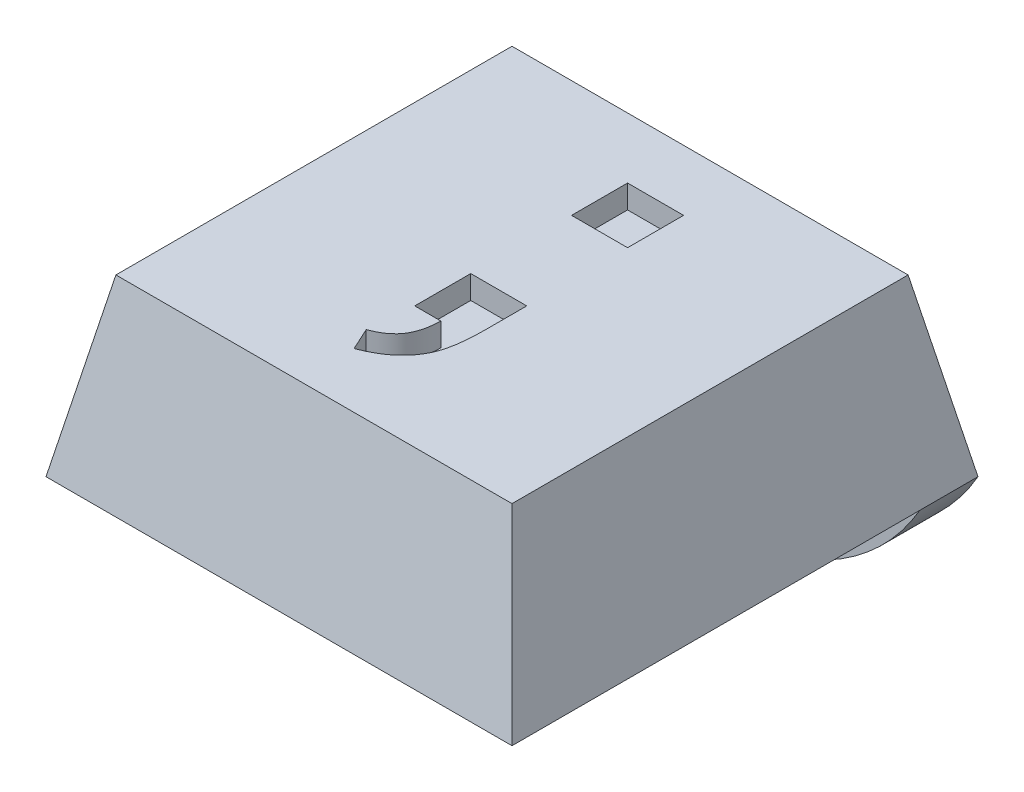
ISO-10303-21;
HEADER;
FILE_DESCRIPTION(('STEP AP214'),'2;1');
FILE_NAME('part.step','',(''),(''),'','','');
FILE_SCHEMA(('AUTOMOTIVE_DESIGN { 1 0 10303 214 1 1 1 1 }'));
ENDSEC;
DATA;
#1=APPLICATION_CONTEXT('core data for automotive mechanical design processes');
#2=APPLICATION_PROTOCOL_DEFINITION('international standard','automotive_design',2000,#1);
#3=PRODUCT_CONTEXT('',#1,'mechanical');
#4=PRODUCT('Part','Part','',(#3));
#5=PRODUCT_RELATED_PRODUCT_CATEGORY('part','',(#4));
#6=PRODUCT_DEFINITION_FORMATION('','',#4);
#7=PRODUCT_DEFINITION_CONTEXT('part definition',#1,'design');
#8=PRODUCT_DEFINITION('design','',#6,#7);
#9=PRODUCT_DEFINITION_SHAPE('','',#8);
#10=(LENGTH_UNIT() NAMED_UNIT(*) SI_UNIT(.MILLI.,.METRE.));
#11=(NAMED_UNIT(*) PLANE_ANGLE_UNIT() SI_UNIT($,.RADIAN.));
#12=(NAMED_UNIT(*) SI_UNIT($,.STERADIAN.) SOLID_ANGLE_UNIT());
#13=UNCERTAINTY_MEASURE_WITH_UNIT(LENGTH_MEASURE(1.E-05),#10,'distance_accuracy_value','');
#14=(GEOMETRIC_REPRESENTATION_CONTEXT(3) GLOBAL_UNCERTAINTY_ASSIGNED_CONTEXT((#13)) GLOBAL_UNIT_ASSIGNED_CONTEXT((#10,
#11,#12)) REPRESENTATION_CONTEXT('',''));
#15=CARTESIAN_POINT('',(0.,0.,0.));
#16=DIRECTION('',(0.,0.,1.));
#17=DIRECTION('',(1.,0.,0.));
#18=AXIS2_PLACEMENT_3D('',#15,#16,#17);
#19=CARTESIAN_POINT('',(0.,3.,0.));
#20=DIRECTION('',(0.,-1.,0.));
#21=DIRECTION('',(0.,0.,-1.));
#22=AXIS2_PLACEMENT_3D('',#19,#20,#21);
#23=PLANE('',#22);
#24=DIRECTION('',(0.,0.,-1.));
#25=VECTOR('',#24,1.);
#26=CARTESIAN_POINT('',(3.62560596272532,3.,-2.70454580911656));
#27=LINE('',#26,#25);
#28=CARTESIAN_POINT('',(3.62560596272532,3.,-2.70454580911656));
#29=VERTEX_POINT('',#28);
#30=CARTESIAN_POINT('',(3.62560596272532,3.,-3.66608427065502));
#31=VERTEX_POINT('',#30);
#32=EDGE_CURVE('E67',#29,#31,#27,.T.);
#33=ORIENTED_EDGE('',*,*,#32,.T.);
#34=DIRECTION('',(1.,0.,0.));
#35=VECTOR('',#34,1.);
#36=CARTESIAN_POINT('',(3.62560596272532,3.,-3.66608427065502));
#37=LINE('',#36,#35);
#38=CARTESIAN_POINT('',(4.58714442426378,3.,-3.66608427065502));
#39=VERTEX_POINT('',#38);
#40=EDGE_CURVE('E258',#31,#39,#37,.T.);
#41=ORIENTED_EDGE('',*,*,#40,.T.);
#42=DIRECTION('',(0.,0.,1.));
#43=VECTOR('',#42,1.);
#44=CARTESIAN_POINT('',(4.58714442426378,3.,-3.66608427065502));
#45=LINE('',#44,#43);
#46=CARTESIAN_POINT('',(4.58714442426378,3.,-2.96696568091143));
#47=VERTEX_POINT('',#46);
#48=EDGE_CURVE('E251',#39,#47,#45,.T.);
#49=ORIENTED_EDGE('',*,*,#48,.T.);
#50=CARTESIAN_POINT('',(4.58714442426378,3.,-2.96696568091143));
#51=CARTESIAN_POINT('',(4.58670080188822,3.,-2.8998214545401));
#52=CARTESIAN_POINT('',(4.58586318464706,3.,-2.773044346911));
#53=CARTESIAN_POINT('',(4.5711807141441,3.,-2.59420782113115));
#54=CARTESIAN_POINT('',(4.55077955569935,3.,-2.43715871833273));
#55=CARTESIAN_POINT('',(4.51832434165699,3.,-2.29987836082914));
#56=CARTESIAN_POINT('',(4.47486996985113,3.,-2.17590282720244));
#57=CARTESIAN_POINT('',(4.41343250196285,3.,-2.0624610132431));
#58=CARTESIAN_POINT('',(4.33787617270612,3.,-1.95390116465176));
#59=CARTESIAN_POINT('',(4.24545832633569,3.,-1.85350819015156));
#60=CARTESIAN_POINT('',(4.13914433473163,3.,-1.76065477060563));
#61=CARTESIAN_POINT('',(4.01770228425887,3.,-1.67990868813372));
#62=CARTESIAN_POINT('',(3.8840141798944,3.,-1.60796791501552));
#63=CARTESIAN_POINT('',(3.78796965576735,3.,-1.57009411793428));
#64=CARTESIAN_POINT('',(3.73878705246891,3.,-1.5506996552704));
#65=B_SPLINE_CURVE_WITH_KNOTS('',3,(#50,#51,#52,#53,#54,#55,#56,#57,#58,#59,#60,#61,#62,#63,
#64),.UNSPECIFIED.,.F.,.F.,(4,1,1,1,1,1,1,1,1,1,1,1,4),(0.,0.11226306929848,0.211967401940366,
0.29994169044828,0.376872974033872,0.447529216959618,0.518973247744178,0.591939579442453,
0.668229800220916,0.746606683184937,0.827453118097728,0.911641971053369,1.),.UNSPECIFIED.);
#66=CARTESIAN_POINT('',(3.73878705246891,3.,-1.5506996552704));
#67=VERTEX_POINT('',#66);
#68=EDGE_CURVE('E245',#47,#67,#65,.T.);
#69=ORIENTED_EDGE('',*,*,#68,.T.);
#70=DIRECTION('',(-0.418608195745655,0.,-0.908166933143113));
#71=VECTOR('',#70,1.);
#72=CARTESIAN_POINT('',(3.73878705246891,3.,-1.5506996552704));
#73=LINE('',#72,#71);
#74=CARTESIAN_POINT('',(3.56150339862276,3.,-1.93531503988579));
#75=VERTEX_POINT('',#74);
#76=EDGE_CURVE('E238',#67,#75,#73,.T.);
#77=ORIENTED_EDGE('',*,*,#76,.T.);
#78=CARTESIAN_POINT('',(3.56150339862276,3.,-1.93531503988579));
#79=CARTESIAN_POINT('',(3.60443904727415,3.,-1.95287327859119));
#80=CARTESIAN_POINT('',(3.68652767187352,3.,-1.98644285797304));
#81=CARTESIAN_POINT('',(3.79593869083479,3.,-2.05254331387848));
#82=CARTESIAN_POINT('',(3.88510542084114,3.,-2.12979243913342));
#83=CARTESIAN_POINT('',(3.95578080095513,3.,-2.21816567640612));
#84=CARTESIAN_POINT('',(4.00665680397726,3.,-2.32038588001785));
#85=CARTESIAN_POINT('',(4.0454560874376,3.,-2.4351046568917));
#86=CARTESIAN_POINT('',(4.06746970030978,3.,-2.56519407020958));
#87=CARTESIAN_POINT('',(4.07197181972445,3.,-2.65672585366105));
#88=CARTESIAN_POINT('',(4.07432391144327,3.,-2.70454580911656));
#89=B_SPLINE_CURVE_WITH_KNOTS('',3,(#78,#79,#80,#81,#82,#83,#84,#85,#86,#87,#88),.UNSPECIFIED.,
.F.,.F.,(4,1,1,1,1,1,1,1,4),(0.,0.139427091721974,0.266570520088693,0.382614322525073,
0.49274666985973,0.604615352902253,0.724373630152636,0.856001486790094,1.),.UNSPECIFIED.);
#90=CARTESIAN_POINT('',(4.07432391144327,3.,-2.70454580911656));
#91=VERTEX_POINT('',#90);
#92=EDGE_CURVE('E231',#75,#91,#89,.T.);
#93=ORIENTED_EDGE('',*,*,#92,.T.);
#94=DIRECTION('',(-1.,0.,0.));
#95=VECTOR('',#94,1.);
#96=CARTESIAN_POINT('',(4.07432391144327,3.,-2.70454580911656));
#97=LINE('',#96,#95);
#98=EDGE_CURVE('E227',#91,#29,#97,.T.);
#99=ORIENTED_EDGE('',*,*,#98,.T.);
#100=EDGE_LOOP('',(#33,#41,#49,#69,#77,#93,#99));
#101=FACE_BOUND('',#100,.T.);
#102=DIRECTION('',(-1.,0.,0.));
#103=VECTOR('',#102,1.);
#104=CARTESIAN_POINT('',(11.,3.,-0.6));
#105=LINE('',#104,#103);
#106=CARTESIAN_POINT('',(7.4,3.,-0.6));
#107=VERTEX_POINT('',#106);
#108=CARTESIAN_POINT('',(0.6,3.,-0.6));
#109=VERTEX_POINT('',#108);
#110=EDGE_CURVE('E378',#107,#109,#105,.T.);
#111=ORIENTED_EDGE('',*,*,#110,.F.);
#112=DIRECTION('',(0.,0.,1.));
#113=VECTOR('',#112,1.);
#114=CARTESIAN_POINT('',(7.4,3.,-8.));
#115=LINE('',#114,#113);
#116=CARTESIAN_POINT('',(7.4,3.,-7.4));
#117=VERTEX_POINT('',#116);
#118=EDGE_CURVE('E391',#117,#107,#115,.T.);
#119=ORIENTED_EDGE('',*,*,#118,.F.);
#120=DIRECTION('',(-1.,0.,0.));
#121=VECTOR('',#120,1.);
#122=CARTESIAN_POINT('',(11.,3.,-7.4));
#123=LINE('',#122,#121);
#124=CARTESIAN_POINT('',(0.599999999999999,3.,-7.4));
#125=VERTEX_POINT('',#124);
#126=EDGE_CURVE('E374',#117,#125,#123,.T.);
#127=ORIENTED_EDGE('',*,*,#126,.T.);
#128=DIRECTION('',(0.,0.,1.));
#129=VECTOR('',#128,1.);
#130=CARTESIAN_POINT('',(0.6,3.,-8.));
#131=LINE('',#130,#129);
#132=EDGE_CURVE('E394',#125,#109,#131,.T.);
#133=ORIENTED_EDGE('',*,*,#132,.T.);
#134=EDGE_LOOP('',(#111,#119,#127,#133));
#135=FACE_BOUND('',#134,.T.);
#136=DIRECTION('',(-1.,0.,0.));
#137=VECTOR('',#136,1.);
#138=CARTESIAN_POINT('',(4.58714442426378,3.,-5.39685350142425));
#139=LINE('',#138,#137);
#140=CARTESIAN_POINT('',(4.58714442426378,3.,-5.39685350142425));
#141=VERTEX_POINT('',#140);
#142=CARTESIAN_POINT('',(3.62560596272532,3.,-5.39685350142425));
#143=VERTEX_POINT('',#142);
#144=EDGE_CURVE('E59',#141,#143,#139,.T.);
#145=ORIENTED_EDGE('',*,*,#144,.T.);
#146=DIRECTION('',(0.,0.,-1.));
#147=VECTOR('',#146,1.);
#148=CARTESIAN_POINT('',(3.62560596272532,3.,-5.39685350142425));
#149=LINE('',#148,#147);
#150=CARTESIAN_POINT('',(3.62560596272532,3.,-6.35839196296271));
#151=VERTEX_POINT('',#150);
#152=EDGE_CURVE('E191',#143,#151,#149,.T.);
#153=ORIENTED_EDGE('',*,*,#152,.T.);
#154=DIRECTION('',(1.,0.,0.));
#155=VECTOR('',#154,1.);
#156=CARTESIAN_POINT('',(3.62560596272532,3.,-6.35839196296271));
#157=LINE('',#156,#155);
#158=CARTESIAN_POINT('',(4.58714442426378,3.,-6.35839196296271));
#159=VERTEX_POINT('',#158);
#160=EDGE_CURVE('E463',#151,#159,#157,.T.);
#161=ORIENTED_EDGE('',*,*,#160,.T.);
#162=DIRECTION('',(0.,0.,1.));
#163=VECTOR('',#162,1.);
#164=CARTESIAN_POINT('',(4.58714442426378,3.,-6.35839196296271));
#165=LINE('',#164,#163);
#166=EDGE_CURVE('E187',#159,#141,#165,.T.);
#167=ORIENTED_EDGE('',*,*,#166,.T.);
#168=EDGE_LOOP('',(#145,#153,#161,#167));
#169=FACE_BOUND('',#168,.T.);
#170=ADVANCED_FACE('F43',(#101,#135,#169),#23,.F.);
#171=CARTESIAN_POINT('',(8.,0.,-8.));
#172=DIRECTION('',(-0.98058067569092,-0.196116135138184,0.));
#173=DIRECTION('',(0.196116135138184,-0.98058067569092,0.));
#174=AXIS2_PLACEMENT_3D('',#171,#172,#173);
#175=PLANE('',#174);
#176=DIRECTION('',(-0.192450089729875,0.962250448649376,-0.192450089729875));
#177=VECTOR('',#176,1.);
#178=CARTESIAN_POINT('',(7.7037037037037,1.48148148148148,-0.296296296296296));
#179=LINE('',#178,#177);
#180=CARTESIAN_POINT('',(8.,0.,0.));
#181=VERTEX_POINT('',#180);
#182=EDGE_CURVE('E388',#181,#107,#179,.T.);
#183=ORIENTED_EDGE('',*,*,#182,.F.);
#184=DIRECTION('',(0.,0.,-1.));
#185=VECTOR('',#184,1.);
#186=CARTESIAN_POINT('',(8.,0.,0.));
#187=LINE('',#186,#185);
#188=CARTESIAN_POINT('',(8.,0.,-7.));
#189=VERTEX_POINT('',#188);
#190=EDGE_CURVE('E405',#181,#189,#187,.T.);
#191=ORIENTED_EDGE('',*,*,#190,.T.);
#192=DIRECTION('',(0.,0.,1.));
#193=VECTOR('',#192,1.);
#194=CARTESIAN_POINT('',(8.,0.,-8.));
#195=LINE('',#194,#193);
#196=CARTESIAN_POINT('',(8.,0.,-8.));
#197=VERTEX_POINT('',#196);
#198=EDGE_CURVE('E193',#197,#189,#195,.T.);
#199=ORIENTED_EDGE('',*,*,#198,.F.);
#200=DIRECTION('',(0.192450089729875,-0.962250448649376,-0.192450089729875));
#201=VECTOR('',#200,1.);
#202=CARTESIAN_POINT('',(8.,0.,-8.));
#203=LINE('',#202,#201);
#204=EDGE_CURVE('E381',#117,#197,#203,.T.);
#205=ORIENTED_EDGE('',*,*,#204,.F.);
#206=ORIENTED_EDGE('',*,*,#118,.T.);
#207=EDGE_LOOP('',(#183,#191,#199,#205,#206));
#208=FACE_BOUND('',#207,.T.);
#209=ADVANCED_FACE('F326',(#208),#175,.F.);
#210=CARTESIAN_POINT('',(0.,0.,-8.));
#211=DIRECTION('',(0.98058067569092,-0.196116135138184,0.));
#212=DIRECTION('',(0.196116135138184,0.98058067569092,0.));
#213=AXIS2_PLACEMENT_3D('',#210,#211,#212);
#214=PLANE('',#213);
#215=DIRECTION('',(-0.192450089729875,-0.962250448649376,0.192450089729875));
#216=VECTOR('',#215,1.);
#217=CARTESIAN_POINT('',(0.296296296296296,1.48148148148148,-0.296296296296296));
#218=LINE('',#217,#216);
#219=CARTESIAN_POINT('',(0.,0.,0.));
#220=VERTEX_POINT('',#219);
#221=EDGE_CURVE('E430',#109,#220,#218,.T.);
#222=ORIENTED_EDGE('',*,*,#221,.F.);
#223=ORIENTED_EDGE('',*,*,#132,.F.);
#224=DIRECTION('',(0.192450089729875,0.962250448649376,0.192450089729875));
#225=VECTOR('',#224,1.);
#226=CARTESIAN_POINT('',(0.,0.,-8.));
#227=LINE('',#226,#225);
#228=CARTESIAN_POINT('',(0.,0.,-8.));
#229=VERTEX_POINT('',#228);
#230=EDGE_CURVE('E404',#229,#125,#227,.T.);
#231=ORIENTED_EDGE('',*,*,#230,.F.);
#232=DIRECTION('',(0.,0.,1.));
#233=VECTOR('',#232,1.);
#234=CARTESIAN_POINT('',(0.,0.,0.));
#235=LINE('',#234,#233);
#236=CARTESIAN_POINT('',(0.,0.,-7.));
#237=VERTEX_POINT('',#236);
#238=EDGE_CURVE('E409',#229,#237,#235,.T.);
#239=ORIENTED_EDGE('',*,*,#238,.T.);
#240=EDGE_CURVE('E398',#237,#220,#235,.T.);
#241=ORIENTED_EDGE('',*,*,#240,.T.);
#242=EDGE_LOOP('',(#222,#223,#231,#239,#241));
#243=FACE_BOUND('',#242,.T.);
#244=ADVANCED_FACE('F323',(#243),#214,.F.);
#245=CARTESIAN_POINT('',(0.,0.,0.));
#246=DIRECTION('',(0.,-1.,0.));
#247=DIRECTION('',(0.,0.,-1.));
#248=AXIS2_PLACEMENT_3D('',#245,#246,#247);
#249=PLANE('',#248);
#250=DIRECTION('',(-1.,0.,0.));
#251=VECTOR('',#250,1.);
#252=CARTESIAN_POINT('',(0.,0.,-7.));
#253=LINE('',#252,#251);
#254=EDGE_CURVE('E199',#189,#237,#253,.T.);
#255=ORIENTED_EDGE('',*,*,#254,.F.);
#256=ORIENTED_EDGE('',*,*,#190,.F.);
#257=DIRECTION('',(1.,0.,0.));
#258=VECTOR('',#257,1.);
#259=CARTESIAN_POINT('',(0.,0.,0.));
#260=LINE('',#259,#258);
#261=EDGE_CURVE('E406',#220,#181,#260,.T.);
#262=ORIENTED_EDGE('',*,*,#261,.F.);
#263=ORIENTED_EDGE('',*,*,#240,.F.);
#264=EDGE_LOOP('',(#255,#256,#262,#263));
#265=FACE_BOUND('',#264,.T.);
#266=CARTESIAN_POINT('',(4.,0.,-3.75));
#267=DIRECTION('',(0.,-1.,0.));
#268=DIRECTION('',(0.,0.,-1.));
#269=AXIS2_PLACEMENT_3D('',#266,#267,#268);
#270=CIRCLE('',#269,1.75);
#271=CARTESIAN_POINT('',(4.,0.,-5.5));
#272=VERTEX_POINT('',#271);
#273=EDGE_CURVE('E363',#272,#272,#270,.T.);
#274=ORIENTED_EDGE('',*,*,#273,.F.);
#275=EDGE_LOOP('',(#274));
#276=FACE_BOUND('',#275,.T.);
#277=ADVANCED_FACE('F321',(#265,#276),#249,.T.);
#278=CARTESIAN_POINT('',(11.,3.,-7.4));
#279=DIRECTION('',(0.,0.196116135138184,-0.98058067569092));
#280=DIRECTION('',(0.,0.98058067569092,0.196116135138184));
#281=AXIS2_PLACEMENT_3D('',#278,#279,#280);
#282=PLANE('',#281);
#283=ORIENTED_EDGE('',*,*,#204,.T.);
#284=DIRECTION('',(-1.,0.,0.));
#285=VECTOR('',#284,1.);
#286=CARTESIAN_POINT('',(0.,0.,-8.));
#287=LINE('',#286,#285);
#288=EDGE_CURVE('E352',#197,#229,#287,.T.);
#289=ORIENTED_EDGE('',*,*,#288,.T.);
#290=ORIENTED_EDGE('',*,*,#230,.T.);
#291=ORIENTED_EDGE('',*,*,#126,.F.);
#292=EDGE_LOOP('',(#283,#289,#290,#291));
#293=FACE_BOUND('',#292,.T.);
#294=ADVANCED_FACE('F317',(#293),#282,.T.);
#295=CARTESIAN_POINT('',(11.,0.,0.));
#296=DIRECTION('',(0.,0.196116135138184,0.98058067569092));
#297=DIRECTION('',(0.,-0.98058067569092,0.196116135138184));
#298=AXIS2_PLACEMENT_3D('',#295,#296,#297);
#299=PLANE('',#298);
#300=ORIENTED_EDGE('',*,*,#182,.T.);
#301=ORIENTED_EDGE('',*,*,#110,.T.);
#302=ORIENTED_EDGE('',*,*,#221,.T.);
#303=ORIENTED_EDGE('',*,*,#261,.T.);
#304=EDGE_LOOP('',(#300,#301,#302,#303));
#305=FACE_BOUND('',#304,.T.);
#306=ADVANCED_FACE('F313',(#305),#299,.T.);
#307=CARTESIAN_POINT('',(4.,0.4,-3.75));
#308=DIRECTION('',(0.,-1.,0.));
#309=DIRECTION('',(0.,0.,-1.));
#310=AXIS2_PLACEMENT_3D('',#307,#308,#309);
#311=CYLINDRICAL_SURFACE('',#310,1.75);
#312=CARTESIAN_POINT('',(4.,0.4,-3.75));
#313=DIRECTION('',(0.,-1.,0.));
#314=DIRECTION('',(0.,0.,-1.));
#315=AXIS2_PLACEMENT_3D('',#312,#313,#314);
#316=CIRCLE('',#315,1.75);
#317=CARTESIAN_POINT('',(4.,0.4,-5.5));
#318=VERTEX_POINT('',#317);
#319=EDGE_CURVE('E370',#318,#318,#316,.T.);
#320=ORIENTED_EDGE('',*,*,#319,.F.);
#321=EDGE_LOOP('',(#320));
#322=FACE_BOUND('',#321,.T.);
#323=ORIENTED_EDGE('',*,*,#273,.T.);
#324=EDGE_LOOP('',(#323));
#325=FACE_BOUND('',#324,.T.);
#326=ADVANCED_FACE('F309',(#322,#325),#311,.F.);
#327=CARTESIAN_POINT('',(4.,0.4,-3.75));
#328=DIRECTION('',(0.,-1.,0.));
#329=DIRECTION('',(0.,0.,-1.));
#330=AXIS2_PLACEMENT_3D('',#327,#328,#329);
#331=PLANE('',#330);
#332=ORIENTED_EDGE('',*,*,#319,.T.);
#333=EDGE_LOOP('',(#332));
#334=FACE_BOUND('',#333,.T.);
#335=ADVANCED_FACE('F305',(#334),#331,.T.);
#336=CARTESIAN_POINT('',(0.,-2.,-8.));
#337=DIRECTION('',(0.,0.,1.));
#338=DIRECTION('',(1.,0.,0.));
#339=AXIS2_PLACEMENT_3D('',#336,#337,#338);
#340=PLANE('',#339);
#341=ORIENTED_EDGE('',*,*,#288,.F.);
#342=CARTESIAN_POINT('',(4.53589838486225,2.,-8.));
#343=DIRECTION('',(0.,0.,1.));
#344=DIRECTION('',(1.,0.,0.));
#345=AXIS2_PLACEMENT_3D('',#342,#343,#344);
#346=CIRCLE('',#345,4.);
#347=CARTESIAN_POINT('',(4.53589838486225,-2.,-8.));
#348=VERTEX_POINT('',#347);
#349=EDGE_CURVE('E11',#197,#348,#346,.F.);
#350=ORIENTED_EDGE('',*,*,#349,.T.);
#351=DIRECTION('',(1.,0.,0.));
#352=VECTOR('',#351,1.);
#353=CARTESIAN_POINT('',(0.,-2.,-8.));
#354=LINE('',#353,#352);
#355=CARTESIAN_POINT('',(3.46410161513775,-2.,-8.));
#356=VERTEX_POINT('',#355);
#357=EDGE_CURVE('E350',#356,#348,#354,.T.);
#358=ORIENTED_EDGE('',*,*,#357,.F.);
#359=CARTESIAN_POINT('',(3.46410161513775,2.,-8.));
#360=DIRECTION('',(0.,0.,1.));
#361=DIRECTION('',(1.,0.,0.));
#362=AXIS2_PLACEMENT_3D('',#359,#360,#361);
#363=CIRCLE('',#362,4.);
#364=EDGE_CURVE('E52',#356,#229,#363,.F.);
#365=ORIENTED_EDGE('',*,*,#364,.T.);
#366=EDGE_LOOP('',(#341,#350,#358,#365));
#367=FACE_BOUND('',#366,.T.);
#368=ADVANCED_FACE('F301',(#367),#340,.F.);
#369=CARTESIAN_POINT('',(0.,-2.,-7.));
#370=DIRECTION('',(0.,0.,-1.));
#371=DIRECTION('',(-1.,0.,0.));
#372=AXIS2_PLACEMENT_3D('',#369,#370,#371);
#373=PLANE('',#372);
#374=DIRECTION('',(-1.,0.,0.));
#375=VECTOR('',#374,1.);
#376=CARTESIAN_POINT('',(0.,-2.,-7.));
#377=LINE('',#376,#375);
#378=CARTESIAN_POINT('',(4.53589838486225,-2.,-7.));
#379=VERTEX_POINT('',#378);
#380=CARTESIAN_POINT('',(3.46410161513775,-2.,-7.));
#381=VERTEX_POINT('',#380);
#382=EDGE_CURVE('E359',#379,#381,#377,.T.);
#383=ORIENTED_EDGE('',*,*,#382,.F.);
#384=CARTESIAN_POINT('',(4.53589838486225,2.,-7.));
#385=DIRECTION('',(0.,0.,-1.));
#386=DIRECTION('',(-1.,0.,0.));
#387=AXIS2_PLACEMENT_3D('',#384,#385,#386);
#388=CIRCLE('',#387,4.);
#389=EDGE_CURVE('E436',#379,#189,#388,.F.);
#390=ORIENTED_EDGE('',*,*,#389,.T.);
#391=ORIENTED_EDGE('',*,*,#254,.T.);
#392=CARTESIAN_POINT('',(3.46410161513775,2.,-7.));
#393=DIRECTION('',(0.,0.,-1.));
#394=DIRECTION('',(-1.,0.,0.));
#395=AXIS2_PLACEMENT_3D('',#392,#393,#394);
#396=CIRCLE('',#395,4.);
#397=EDGE_CURVE('E433',#237,#381,#396,.F.);
#398=ORIENTED_EDGE('',*,*,#397,.T.);
#399=EDGE_LOOP('',(#383,#390,#391,#398));
#400=FACE_BOUND('',#399,.T.);
#401=ADVANCED_FACE('F297',(#400),#373,.F.);
#402=CARTESIAN_POINT('',(0.,-2.,0.));
#403=DIRECTION('',(0.,1.,0.));
#404=DIRECTION('',(0.,0.,1.));
#405=AXIS2_PLACEMENT_3D('',#402,#403,#404);
#406=PLANE('',#405);
#407=ORIENTED_EDGE('',*,*,#357,.T.);
#408=DIRECTION('',(0.,0.,1.));
#409=VECTOR('',#408,1.);
#410=CARTESIAN_POINT('',(4.53589838486225,-2.,0.));
#411=LINE('',#410,#409);
#412=EDGE_CURVE('E346',#348,#379,#411,.T.);
#413=ORIENTED_EDGE('',*,*,#412,.T.);
#414=ORIENTED_EDGE('',*,*,#382,.T.);
#415=DIRECTION('',(0.,0.,-1.));
#416=VECTOR('',#415,1.);
#417=CARTESIAN_POINT('',(3.46410161513775,-2.,0.));
#418=LINE('',#417,#416);
#419=EDGE_CURVE('E357',#381,#356,#418,.T.);
#420=ORIENTED_EDGE('',*,*,#419,.T.);
#421=EDGE_LOOP('',(#407,#413,#414,#420));
#422=FACE_BOUND('',#421,.T.);
#423=ADVANCED_FACE('F293',(#422),#406,.F.);
#424=CARTESIAN_POINT('',(4.53589838486225,2.,-8.));
#425=DIRECTION('',(0.,0.,1.));
#426=DIRECTION('',(1.,0.,0.));
#427=AXIS2_PLACEMENT_3D('',#424,#425,#426);
#428=CYLINDRICAL_SURFACE('',#427,4.);
#429=ORIENTED_EDGE('',*,*,#349,.F.);
#430=ORIENTED_EDGE('',*,*,#198,.T.);
#431=ORIENTED_EDGE('',*,*,#389,.F.);
#432=ORIENTED_EDGE('',*,*,#412,.F.);
#433=EDGE_LOOP('',(#429,#430,#431,#432));
#434=FACE_BOUND('',#433,.T.);
#435=ADVANCED_FACE('F296',(#434),#428,.T.);
#436=CARTESIAN_POINT('',(3.46410161513775,2.,-8.));
#437=DIRECTION('',(0.,0.,-1.));
#438=DIRECTION('',(-1.,0.,0.));
#439=AXIS2_PLACEMENT_3D('',#436,#437,#438);
#440=CYLINDRICAL_SURFACE('',#439,4.);
#441=ORIENTED_EDGE('',*,*,#397,.F.);
#442=ORIENTED_EDGE('',*,*,#238,.F.);
#443=ORIENTED_EDGE('',*,*,#364,.F.);
#444=ORIENTED_EDGE('',*,*,#419,.F.);
#445=EDGE_LOOP('',(#441,#442,#443,#444));
#446=FACE_BOUND('',#445,.T.);
#447=ADVANCED_FACE('F45',(#446),#440,.T.);
#448=CARTESIAN_POINT('',(3.62560596272532,2.6,-2.70454580911656));
#449=DIRECTION('',(1.,0.,0.));
#450=DIRECTION('',(0.,0.,-1.));
#451=AXIS2_PLACEMENT_3D('',#448,#449,#450);
#452=PLANE('',#451);
#453=ORIENTED_EDGE('',*,*,#32,.F.);
#454=DIRECTION('',(0.,1.,0.));
#455=VECTOR('',#454,1.);
#456=CARTESIAN_POINT('',(3.62560596272532,2.6,-2.70454580911656));
#457=LINE('',#456,#455);
#458=CARTESIAN_POINT('',(3.62560596272532,2.6,-2.70454580911656));
#459=VERTEX_POINT('',#458);
#460=EDGE_CURVE('E223',#459,#29,#457,.T.);
#461=ORIENTED_EDGE('',*,*,#460,.F.);
#462=DIRECTION('',(0.,0.,-1.));
#463=VECTOR('',#462,1.);
#464=CARTESIAN_POINT('',(3.62560596272532,2.6,-2.70454580911656));
#465=LINE('',#464,#463);
#466=CARTESIAN_POINT('',(3.62560596272532,2.6,-3.66608427065502));
#467=VERTEX_POINT('',#466);
#468=EDGE_CURVE('E232',#459,#467,#465,.T.);
#469=ORIENTED_EDGE('',*,*,#468,.T.);
#470=DIRECTION('',(0.,1.,0.));
#471=VECTOR('',#470,1.);
#472=CARTESIAN_POINT('',(3.62560596272532,2.6,-3.66608427065502));
#473=LINE('',#472,#471);
#474=EDGE_CURVE('E205',#467,#31,#473,.T.);
#475=ORIENTED_EDGE('',*,*,#474,.T.);
#476=EDGE_LOOP('',(#453,#461,#469,#475));
#477=FACE_BOUND('',#476,.T.);
#478=ADVANCED_FACE('F341',(#477),#452,.T.);
#479=CARTESIAN_POINT('',(3.62560596272532,2.6,-3.66608427065502));
#480=DIRECTION('',(0.,0.,1.));
#481=DIRECTION('',(1.,0.,0.));
#482=AXIS2_PLACEMENT_3D('',#479,#480,#481);
#483=PLANE('',#482);
#484=ORIENTED_EDGE('',*,*,#40,.F.);
#485=ORIENTED_EDGE('',*,*,#474,.F.);
#486=DIRECTION('',(1.,0.,0.));
#487=VECTOR('',#486,1.);
#488=CARTESIAN_POINT('',(3.62560596272532,2.6,-3.66608427065502));
#489=LINE('',#488,#487);
#490=CARTESIAN_POINT('',(4.58714442426378,2.6,-3.66608427065502));
#491=VERTEX_POINT('',#490);
#492=EDGE_CURVE('E519',#467,#491,#489,.T.);
#493=ORIENTED_EDGE('',*,*,#492,.T.);
#494=DIRECTION('',(0.,1.,0.));
#495=VECTOR('',#494,1.);
#496=CARTESIAN_POINT('',(4.58714442426378,2.6,-3.66608427065502));
#497=LINE('',#496,#495);
#498=EDGE_CURVE('E208',#491,#39,#497,.T.);
#499=ORIENTED_EDGE('',*,*,#498,.T.);
#500=EDGE_LOOP('',(#484,#485,#493,#499));
#501=FACE_BOUND('',#500,.T.);
#502=ADVANCED_FACE('F498',(#501),#483,.T.);
#503=CARTESIAN_POINT('',(4.58714442426378,2.6,-3.66608427065502));
#504=DIRECTION('',(-1.,0.,0.));
#505=DIRECTION('',(0.,0.,1.));
#506=AXIS2_PLACEMENT_3D('',#503,#504,#505);
#507=PLANE('',#506);
#508=ORIENTED_EDGE('',*,*,#48,.F.);
#509=ORIENTED_EDGE('',*,*,#498,.F.);
#510=DIRECTION('',(0.,0.,1.));
#511=VECTOR('',#510,1.);
#512=CARTESIAN_POINT('',(4.58714442426378,2.6,-3.66608427065502));
#513=LINE('',#512,#511);
#514=CARTESIAN_POINT('',(4.58714442426378,2.6,-2.96696568091143));
#515=VERTEX_POINT('',#514);
#516=EDGE_CURVE('E514',#491,#515,#513,.T.);
#517=ORIENTED_EDGE('',*,*,#516,.T.);
#518=DIRECTION('',(0.,1.,0.));
#519=VECTOR('',#518,1.);
#520=CARTESIAN_POINT('',(4.58714442426378,2.6,-2.96696568091143));
#521=LINE('',#520,#519);
#522=EDGE_CURVE('E211',#515,#47,#521,.T.);
#523=ORIENTED_EDGE('',*,*,#522,.T.);
#524=EDGE_LOOP('',(#508,#509,#517,#523));
#525=FACE_BOUND('',#524,.T.);
#526=ADVANCED_FACE('F501',(#525),#507,.T.);
#527=CARTESIAN_POINT('',(4.58714442426378,2.6,-2.96696568091143));
#528=CARTESIAN_POINT('',(4.58670080188822,2.6,-2.8998214545401));
#529=CARTESIAN_POINT('',(4.58586318464706,2.6,-2.773044346911));
#530=CARTESIAN_POINT('',(4.5711807141441,2.6,-2.59420782113115));
#531=CARTESIAN_POINT('',(4.55077955569935,2.6,-2.43715871833273));
#532=CARTESIAN_POINT('',(4.51832434165699,2.6,-2.29987836082914));
#533=CARTESIAN_POINT('',(4.47486996985113,2.6,-2.17590282720244));
#534=CARTESIAN_POINT('',(4.41343250196285,2.6,-2.0624610132431));
#535=CARTESIAN_POINT('',(4.33787617270612,2.6,-1.95390116465176));
#536=CARTESIAN_POINT('',(4.24545832633569,2.6,-1.85350819015156));
#537=CARTESIAN_POINT('',(4.13914433473163,2.6,-1.76065477060563));
#538=CARTESIAN_POINT('',(4.01770228425887,2.6,-1.67990868813372));
#539=CARTESIAN_POINT('',(3.8840141798944,2.6,-1.60796791501552));
#540=CARTESIAN_POINT('',(3.78796965576735,2.6,-1.57009411793428));
#541=CARTESIAN_POINT('',(3.73878705246891,2.6,-1.5506996552704));
#542=B_SPLINE_CURVE_WITH_KNOTS('',3,(#527,#528,#529,#530,#531,#532,#533,#534,#535,#536,#537,
#538,#539,#540,#541),.UNSPECIFIED.,.F.,.F.,(4,1,1,1,1,1,1,1,1,1,1,1,4),(0.,0.11226306929848,
0.211967401940366,0.29994169044828,0.376872974033872,0.447529216959618,0.518973247744178,
0.591939579442453,0.668229800220916,0.746606683184937,0.827453118097728,0.911641971053369,1.),.UNSPECIFIED.);
#543=DIRECTION('',(0.,1.,0.));
#544=VECTOR('',#543,1.);
#545=SURFACE_OF_LINEAR_EXTRUSION('',#542,#544);
#546=ORIENTED_EDGE('',*,*,#68,.F.);
#547=ORIENTED_EDGE('',*,*,#522,.F.);
#548=CARTESIAN_POINT('',(3.73878705246891,2.6,-1.5506996552704));
#549=VERTEX_POINT('',#548);
#550=EDGE_CURVE('E508',#515,#549,#542,.T.);
#551=ORIENTED_EDGE('',*,*,#550,.T.);
#552=DIRECTION('',(0.,1.,0.));
#553=VECTOR('',#552,1.);
#554=CARTESIAN_POINT('',(3.73878705246891,2.6,-1.5506996552704));
#555=LINE('',#554,#553);
#556=EDGE_CURVE('E214',#549,#67,#555,.T.);
#557=ORIENTED_EDGE('',*,*,#556,.T.);
#558=EDGE_LOOP('',(#546,#547,#551,#557));
#559=FACE_BOUND('',#558,.T.);
#560=ADVANCED_FACE('F504',(#559),#545,.T.);
#561=CARTESIAN_POINT('',(3.73878705246891,2.6,-1.5506996552704));
#562=DIRECTION('',(0.908166933143113,0.,-0.418608195745655));
#563=DIRECTION('',(-0.418608195745655,0.,-0.908166933143113));
#564=AXIS2_PLACEMENT_3D('',#561,#562,#563);
#565=PLANE('',#564);
#566=ORIENTED_EDGE('',*,*,#76,.F.);
#567=ORIENTED_EDGE('',*,*,#556,.F.);
#568=DIRECTION('',(-0.418608195745655,0.,-0.908166933143113));
#569=VECTOR('',#568,1.);
#570=CARTESIAN_POINT('',(3.73878705246891,2.6,-1.5506996552704));
#571=LINE('',#570,#569);
#572=CARTESIAN_POINT('',(3.56150339862276,2.6,-1.93531503988579));
#573=VERTEX_POINT('',#572);
#574=EDGE_CURVE('E272',#549,#573,#571,.T.);
#575=ORIENTED_EDGE('',*,*,#574,.T.);
#576=DIRECTION('',(0.,1.,0.));
#577=VECTOR('',#576,1.);
#578=CARTESIAN_POINT('',(3.56150339862276,2.6,-1.93531503988579));
#579=LINE('',#578,#577);
#580=EDGE_CURVE('E217',#573,#75,#579,.T.);
#581=ORIENTED_EDGE('',*,*,#580,.T.);
#582=EDGE_LOOP('',(#566,#567,#575,#581));
#583=FACE_BOUND('',#582,.T.);
#584=ADVANCED_FACE('F283',(#583),#565,.T.);
#585=CARTESIAN_POINT('',(3.56150339862276,2.6,-1.93531503988579));
#586=CARTESIAN_POINT('',(3.60443904727415,2.6,-1.95287327859119));
#587=CARTESIAN_POINT('',(3.68652767187352,2.6,-1.98644285797304));
#588=CARTESIAN_POINT('',(3.79593869083479,2.6,-2.05254331387848));
#589=CARTESIAN_POINT('',(3.88510542084114,2.6,-2.12979243913342));
#590=CARTESIAN_POINT('',(3.95578080095513,2.6,-2.21816567640612));
#591=CARTESIAN_POINT('',(4.00665680397726,2.6,-2.32038588001785));
#592=CARTESIAN_POINT('',(4.0454560874376,2.6,-2.4351046568917));
#593=CARTESIAN_POINT('',(4.06746970030978,2.6,-2.56519407020958));
#594=CARTESIAN_POINT('',(4.07197181972445,2.6,-2.65672585366105));
#595=CARTESIAN_POINT('',(4.07432391144327,2.6,-2.70454580911656));
#596=B_SPLINE_CURVE_WITH_KNOTS('',3,(#585,#586,#587,#588,#589,#590,#591,#592,#593,#594,#595),
.UNSPECIFIED.,.F.,.F.,(4,1,1,1,1,1,1,1,4),(0.,0.139427091721974,0.266570520088693,
0.382614322525073,0.49274666985973,0.604615352902253,0.724373630152636,0.856001486790094,1.),.UNSPECIFIED.);
#597=DIRECTION('',(0.,1.,0.));
#598=VECTOR('',#597,1.);
#599=SURFACE_OF_LINEAR_EXTRUSION('',#596,#598);
#600=ORIENTED_EDGE('',*,*,#92,.F.);
#601=ORIENTED_EDGE('',*,*,#580,.F.);
#602=CARTESIAN_POINT('',(4.07432391144327,2.6,-2.70454580911656));
#603=VERTEX_POINT('',#602);
#604=EDGE_CURVE('E266',#573,#603,#596,.T.);
#605=ORIENTED_EDGE('',*,*,#604,.T.);
#606=DIRECTION('',(0.,1.,0.));
#607=VECTOR('',#606,1.);
#608=CARTESIAN_POINT('',(4.07432391144327,2.6,-2.70454580911656));
#609=LINE('',#608,#607);
#610=EDGE_CURVE('E220',#603,#91,#609,.T.);
#611=ORIENTED_EDGE('',*,*,#610,.T.);
#612=EDGE_LOOP('',(#600,#601,#605,#611));
#613=FACE_BOUND('',#612,.T.);
#614=ADVANCED_FACE('F278',(#613),#599,.T.);
#615=CARTESIAN_POINT('',(4.07432391144327,2.6,-2.70454580911656));
#616=DIRECTION('',(0.,0.,-1.));
#617=DIRECTION('',(-1.,0.,0.));
#618=AXIS2_PLACEMENT_3D('',#615,#616,#617);
#619=PLANE('',#618);
#620=ORIENTED_EDGE('',*,*,#98,.F.);
#621=ORIENTED_EDGE('',*,*,#610,.F.);
#622=DIRECTION('',(-1.,0.,0.));
#623=VECTOR('',#622,1.);
#624=CARTESIAN_POINT('',(4.07432391144327,2.6,-2.70454580911656));
#625=LINE('',#624,#623);
#626=EDGE_CURVE('E226',#603,#459,#625,.T.);
#627=ORIENTED_EDGE('',*,*,#626,.T.);
#628=ORIENTED_EDGE('',*,*,#460,.T.);
#629=EDGE_LOOP('',(#620,#621,#627,#628));
#630=FACE_BOUND('',#629,.T.);
#631=ADVANCED_FACE('F282',(#630),#619,.T.);
#632=CARTESIAN_POINT('',(4.42927512303432,2.6,-2.09381180677731));
#633=DIRECTION('',(1.14085817799472E-13,1.,0.));
#634=DIRECTION('',(-1.,1.14085817799472E-13,0.));
#635=AXIS2_PLACEMENT_3D('',#632,#633,#634);
#636=PLANE('',#635);
#637=ORIENTED_EDGE('',*,*,#468,.F.);
#638=ORIENTED_EDGE('',*,*,#626,.F.);
#639=ORIENTED_EDGE('',*,*,#604,.F.);
#640=ORIENTED_EDGE('',*,*,#574,.F.);
#641=ORIENTED_EDGE('',*,*,#550,.F.);
#642=ORIENTED_EDGE('',*,*,#516,.F.);
#643=ORIENTED_EDGE('',*,*,#492,.F.);
#644=EDGE_LOOP('',(#637,#638,#639,#640,#641,#642,#643));
#645=FACE_BOUND('',#644,.T.);
#646=ADVANCED_FACE('F288',(#645),#636,.T.);
#647=CARTESIAN_POINT('',(4.58714442426378,2.6,-5.39685350142425));
#648=DIRECTION('',(0.,0.,-1.));
#649=DIRECTION('',(-1.,0.,0.));
#650=AXIS2_PLACEMENT_3D('',#647,#648,#649);
#651=PLANE('',#650);
#652=ORIENTED_EDGE('',*,*,#144,.F.);
#653=DIRECTION('',(0.,1.,0.));
#654=VECTOR('',#653,1.);
#655=CARTESIAN_POINT('',(4.58714442426378,2.6,-5.39685350142425));
#656=LINE('',#655,#654);
#657=CARTESIAN_POINT('',(4.58714442426378,2.6,-5.39685350142425));
#658=VERTEX_POINT('',#657);
#659=EDGE_CURVE('E185',#658,#141,#656,.T.);
#660=ORIENTED_EDGE('',*,*,#659,.F.);
#661=DIRECTION('',(-1.,0.,0.));
#662=VECTOR('',#661,1.);
#663=CARTESIAN_POINT('',(4.58714442426378,2.6,-5.39685350142425));
#664=LINE('',#663,#662);
#665=CARTESIAN_POINT('',(3.62560596272532,2.6,-5.39685350142425));
#666=VERTEX_POINT('',#665);
#667=EDGE_CURVE('E176',#658,#666,#664,.T.);
#668=ORIENTED_EDGE('',*,*,#667,.T.);
#669=DIRECTION('',(0.,1.,0.));
#670=VECTOR('',#669,1.);
#671=CARTESIAN_POINT('',(3.62560596272532,2.6,-5.39685350142425));
#672=LINE('',#671,#670);
#673=EDGE_CURVE('E184',#666,#143,#672,.T.);
#674=ORIENTED_EDGE('',*,*,#673,.T.);
#675=EDGE_LOOP('',(#652,#660,#668,#674));
#676=FACE_BOUND('',#675,.T.);
#677=ADVANCED_FACE('F183',(#676),#651,.T.);
#678=CARTESIAN_POINT('',(3.62560596272532,2.6,-5.39685350142425));
#679=DIRECTION('',(1.,0.,0.));
#680=DIRECTION('',(0.,0.,-1.));
#681=AXIS2_PLACEMENT_3D('',#678,#679,#680);
#682=PLANE('',#681);
#683=ORIENTED_EDGE('',*,*,#152,.F.);
#684=ORIENTED_EDGE('',*,*,#673,.F.);
#685=DIRECTION('',(0.,0.,-1.));
#686=VECTOR('',#685,1.);
#687=CARTESIAN_POINT('',(3.62560596272532,2.6,-5.39685350142425));
#688=LINE('',#687,#686);
#689=CARTESIAN_POINT('',(3.62560596272532,2.6,-6.35839196296271));
#690=VERTEX_POINT('',#689);
#691=EDGE_CURVE('E172',#666,#690,#688,.T.);
#692=ORIENTED_EDGE('',*,*,#691,.T.);
#693=DIRECTION('',(0.,1.,0.));
#694=VECTOR('',#693,1.);
#695=CARTESIAN_POINT('',(3.62560596272532,2.6,-6.35839196296271));
#696=LINE('',#695,#694);
#697=EDGE_CURVE('E194',#690,#151,#696,.T.);
#698=ORIENTED_EDGE('',*,*,#697,.T.);
#699=EDGE_LOOP('',(#683,#684,#692,#698));
#700=FACE_BOUND('',#699,.T.);
#701=ADVANCED_FACE('F189',(#700),#682,.T.);
#702=CARTESIAN_POINT('',(3.62560596272532,2.6,-6.35839196296271));
#703=DIRECTION('',(0.,0.,1.));
#704=DIRECTION('',(1.,0.,0.));
#705=AXIS2_PLACEMENT_3D('',#702,#703,#704);
#706=PLANE('',#705);
#707=ORIENTED_EDGE('',*,*,#160,.F.);
#708=ORIENTED_EDGE('',*,*,#697,.F.);
#709=DIRECTION('',(1.,0.,0.));
#710=VECTOR('',#709,1.);
#711=CARTESIAN_POINT('',(3.62560596272532,2.6,-6.35839196296271));
#712=LINE('',#711,#710);
#713=CARTESIAN_POINT('',(4.58714442426378,2.6,-6.35839196296271));
#714=VERTEX_POINT('',#713);
#715=EDGE_CURVE('E177',#690,#714,#712,.T.);
#716=ORIENTED_EDGE('',*,*,#715,.T.);
#717=DIRECTION('',(0.,1.,0.));
#718=VECTOR('',#717,1.);
#719=CARTESIAN_POINT('',(4.58714442426378,2.6,-6.35839196296271));
#720=LINE('',#719,#718);
#721=EDGE_CURVE('E201',#714,#159,#720,.T.);
#722=ORIENTED_EDGE('',*,*,#721,.T.);
#723=EDGE_LOOP('',(#707,#708,#716,#722));
#724=FACE_BOUND('',#723,.T.);
#725=ADVANCED_FACE('F478',(#724),#706,.T.);
#726=CARTESIAN_POINT('',(4.58714442426378,2.6,-6.35839196296271));
#727=DIRECTION('',(-1.,0.,0.));
#728=DIRECTION('',(0.,0.,1.));
#729=AXIS2_PLACEMENT_3D('',#726,#727,#728);
#730=PLANE('',#729);
#731=ORIENTED_EDGE('',*,*,#166,.F.);
#732=ORIENTED_EDGE('',*,*,#721,.F.);
#733=DIRECTION('',(0.,0.,1.));
#734=VECTOR('',#733,1.);
#735=CARTESIAN_POINT('',(4.58714442426378,2.6,-6.35839196296271));
#736=LINE('',#735,#734);
#737=EDGE_CURVE('E466',#714,#658,#736,.T.);
#738=ORIENTED_EDGE('',*,*,#737,.T.);
#739=ORIENTED_EDGE('',*,*,#659,.T.);
#740=EDGE_LOOP('',(#731,#732,#738,#739));
#741=FACE_BOUND('',#740,.T.);
#742=ADVANCED_FACE('F480',(#741),#730,.T.);
#743=CARTESIAN_POINT('',(0.,2.6,0.));
#744=DIRECTION('',(0.,-1.,0.));
#745=DIRECTION('',(0.,0.,-1.));
#746=AXIS2_PLACEMENT_3D('',#743,#744,#745);
#747=PLANE('',#746);
#748=ORIENTED_EDGE('',*,*,#667,.F.);
#749=ORIENTED_EDGE('',*,*,#737,.F.);
#750=ORIENTED_EDGE('',*,*,#715,.F.);
#751=ORIENTED_EDGE('',*,*,#691,.F.);
#752=EDGE_LOOP('',(#748,#749,#750,#751));
#753=FACE_BOUND('',#752,.T.);
#754=ADVANCED_FACE('F174',(#753),#747,.F.);
#755=CLOSED_SHELL('',(#170,#209,#244,#277,#294,#306,#326,#335,#368,#401,#423,#435,#447,#478,
#502,#526,#560,#584,#614,#631,#646,#677,#701,#725,#742,#754));
#756=MANIFOLD_SOLID_BREP('B2',#755);
#757=ADVANCED_BREP_SHAPE_REPRESENTATION('',(#18,#756),#14);
#758=SHAPE_DEFINITION_REPRESENTATION(#9,#757);
ENDSEC;
END-ISO-10303-21;
